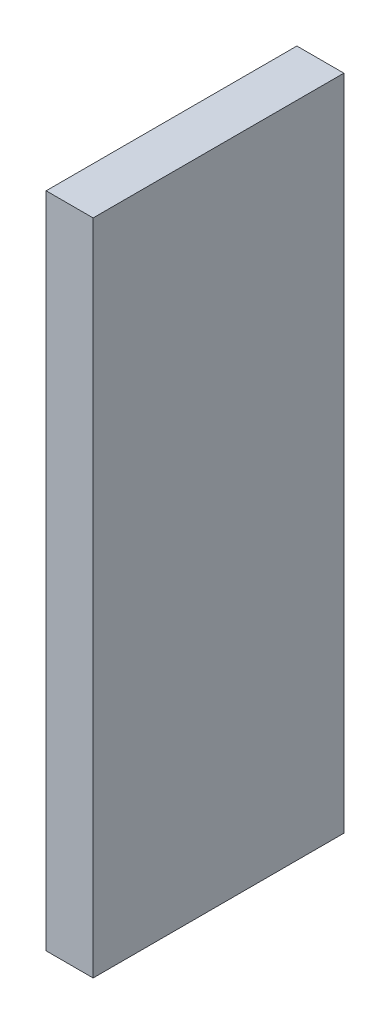
ISO-10303-21;
HEADER;
FILE_DESCRIPTION(('STEP AP214'),'2;1');
FILE_NAME('part.step','',(''),(''),'','','');
FILE_SCHEMA(('AUTOMOTIVE_DESIGN { 1 0 10303 214 1 1 1 1 }'));
ENDSEC;
DATA;
#1=APPLICATION_CONTEXT('core data for automotive mechanical design processes');
#2=APPLICATION_PROTOCOL_DEFINITION('international standard','automotive_design',2000,#1);
#3=PRODUCT_CONTEXT('',#1,'mechanical');
#4=PRODUCT('Part','Part','',(#3));
#5=PRODUCT_RELATED_PRODUCT_CATEGORY('part','',(#4));
#6=PRODUCT_DEFINITION_FORMATION('','',#4);
#7=PRODUCT_DEFINITION_CONTEXT('part definition',#1,'design');
#8=PRODUCT_DEFINITION('design','',#6,#7);
#9=PRODUCT_DEFINITION_SHAPE('','',#8);
#10=(LENGTH_UNIT() NAMED_UNIT(*) SI_UNIT(.MILLI.,.METRE.));
#11=(NAMED_UNIT(*) PLANE_ANGLE_UNIT() SI_UNIT($,.RADIAN.));
#12=(NAMED_UNIT(*) SI_UNIT($,.STERADIAN.) SOLID_ANGLE_UNIT());
#13=UNCERTAINTY_MEASURE_WITH_UNIT(LENGTH_MEASURE(1.E-05),#10,'distance_accuracy_value','');
#14=(GEOMETRIC_REPRESENTATION_CONTEXT(3) GLOBAL_UNCERTAINTY_ASSIGNED_CONTEXT((#13)) GLOBAL_UNIT_ASSIGNED_CONTEXT((#10,
#11,#12)) REPRESENTATION_CONTEXT('',''));
#15=CARTESIAN_POINT('',(0.,0.,0.));
#16=DIRECTION('',(0.,0.,1.));
#17=DIRECTION('',(1.,0.,0.));
#18=AXIS2_PLACEMENT_3D('',#15,#16,#17);
#19=CARTESIAN_POINT('',(-86.6827193201278,-335.705324425128,-870.48614798632));
#20=DIRECTION('',(-1.,0.,0.));
#21=DIRECTION('',(0.,0.,1.));
#22=AXIS2_PLACEMENT_3D('',#19,#20,#21);
#23=PLANE('',#22);
#24=DIRECTION('',(0.,1.,0.));
#25=VECTOR('',#24,1.);
#26=CARTESIAN_POINT('',(-86.6827193201278,-335.705324425128,-830.48614798632));
#27=LINE('',#26,#25);
#28=CARTESIAN_POINT('',(-86.6827193201278,-315.602297752567,-830.48614798632));
#29=VERTEX_POINT('',#28);
#30=CARTESIAN_POINT('',(-86.6827193201278,-525.602297752568,-830.48614798632));
#31=VERTEX_POINT('',#30);
#32=EDGE_CURVE('E83',#29,#31,#27,.F.);
#33=ORIENTED_EDGE('',*,*,#32,.T.);
#34=DIRECTION('',(0.,0.,1.));
#35=VECTOR('',#34,1.);
#36=CARTESIAN_POINT('',(-86.6827193201278,-525.602297752568,-870.48614798632));
#37=LINE('',#36,#35);
#38=CARTESIAN_POINT('',(-86.6827193201278,-525.602297752568,-910.486147986318));
#39=VERTEX_POINT('',#38);
#40=EDGE_CURVE('E59',#31,#39,#37,.F.);
#41=ORIENTED_EDGE('',*,*,#40,.T.);
#42=DIRECTION('',(0.,1.,0.));
#43=VECTOR('',#42,1.);
#44=CARTESIAN_POINT('',(-86.6827193201278,-335.705324425128,-910.486147986318));
#45=LINE('',#44,#43);
#46=CARTESIAN_POINT('',(-86.6827193201278,-315.602297752567,-910.486147986318));
#47=VERTEX_POINT('',#46);
#48=EDGE_CURVE('E20',#47,#39,#45,.F.);
#49=ORIENTED_EDGE('',*,*,#48,.F.);
#50=DIRECTION('',(0.,0.,-1.));
#51=VECTOR('',#50,1.);
#52=CARTESIAN_POINT('',(-86.6827193201278,-315.602297752567,-870.48614798632));
#53=LINE('',#52,#51);
#54=EDGE_CURVE('E56',#47,#29,#53,.F.);
#55=ORIENTED_EDGE('',*,*,#54,.T.);
#56=EDGE_LOOP('',(#33,#41,#49,#55));
#57=FACE_BOUND('',#56,.T.);
#58=ADVANCED_FACE('F17',(#57),#23,.F.);
#59=CARTESIAN_POINT('',(-94.1827193201277,-335.705324425128,-910.486147986318));
#60=DIRECTION('',(0.,0.,-1.));
#61=DIRECTION('',(-1.,0.,0.));
#62=AXIS2_PLACEMENT_3D('',#59,#60,#61);
#63=PLANE('',#62);
#64=ORIENTED_EDGE('',*,*,#48,.T.);
#65=DIRECTION('',(1.,0.,0.));
#66=VECTOR('',#65,1.);
#67=CARTESIAN_POINT('',(-94.1827193201328,-525.602297752568,-910.486147986318));
#68=LINE('',#67,#66);
#69=CARTESIAN_POINT('',(-101.682719320128,-525.602297752568,-910.486147986318));
#70=VERTEX_POINT('',#69);
#71=EDGE_CURVE('E86',#39,#70,#68,.F.);
#72=ORIENTED_EDGE('',*,*,#71,.T.);
#73=DIRECTION('',(0.,1.,0.));
#74=VECTOR('',#73,1.);
#75=CARTESIAN_POINT('',(-101.682719320128,-335.705324425128,-910.486147986318));
#76=LINE('',#75,#74);
#77=CARTESIAN_POINT('',(-101.682719320128,-315.602297752567,-910.486147986318));
#78=VERTEX_POINT('',#77);
#79=EDGE_CURVE('E76',#70,#78,#76,.T.);
#80=ORIENTED_EDGE('',*,*,#79,.T.);
#81=DIRECTION('',(1.,0.,0.));
#82=VECTOR('',#81,1.);
#83=CARTESIAN_POINT('',(-94.1827193201277,-315.602297752567,-910.486147986318));
#84=LINE('',#83,#82);
#85=EDGE_CURVE('E65',#78,#47,#84,.T.);
#86=ORIENTED_EDGE('',*,*,#85,.T.);
#87=EDGE_LOOP('',(#64,#72,#80,#86));
#88=FACE_BOUND('',#87,.T.);
#89=ADVANCED_FACE('F75',(#88),#63,.T.);
#90=CARTESIAN_POINT('',(-94.1827193201277,-315.602297752567,-870.48614798632));
#91=DIRECTION('',(0.,-1.,0.));
#92=DIRECTION('',(0.,0.,-1.));
#93=AXIS2_PLACEMENT_3D('',#90,#91,#92);
#94=PLANE('',#93);
#95=DIRECTION('',(-1.,0.,0.));
#96=VECTOR('',#95,1.);
#97=CARTESIAN_POINT('',(-94.1827193201277,-315.602297752567,-830.48614798632));
#98=LINE('',#97,#96);
#99=CARTESIAN_POINT('',(-101.682719320129,-315.602297752567,-830.48614798632));
#100=VERTEX_POINT('',#99);
#101=EDGE_CURVE('E71',#100,#29,#98,.F.);
#102=ORIENTED_EDGE('',*,*,#101,.T.);
#103=ORIENTED_EDGE('',*,*,#54,.F.);
#104=ORIENTED_EDGE('',*,*,#85,.F.);
#105=DIRECTION('',(0.,0.,-1.));
#106=VECTOR('',#105,1.);
#107=CARTESIAN_POINT('',(-101.682719320128,-315.602297752567,-870.48614798632));
#108=LINE('',#107,#106);
#109=EDGE_CURVE('E94',#78,#100,#108,.F.);
#110=ORIENTED_EDGE('',*,*,#109,.T.);
#111=EDGE_LOOP('',(#102,#103,#104,#110));
#112=FACE_BOUND('',#111,.T.);
#113=ADVANCED_FACE('F68',(#112),#94,.F.);
#114=CARTESIAN_POINT('',(-94.1827193201277,-335.705324425128,-830.48614798632));
#115=DIRECTION('',(0.,0.,-1.));
#116=DIRECTION('',(-1.,0.,0.));
#117=AXIS2_PLACEMENT_3D('',#114,#115,#116);
#118=PLANE('',#117);
#119=DIRECTION('',(1.,0.,0.));
#120=VECTOR('',#119,1.);
#121=CARTESIAN_POINT('',(-94.1827193201328,-525.602297752568,-830.48614798632));
#122=LINE('',#121,#120);
#123=CARTESIAN_POINT('',(-101.682719320129,-525.602297752568,-830.48614798632));
#124=VERTEX_POINT('',#123);
#125=EDGE_CURVE('E35',#124,#31,#122,.T.);
#126=ORIENTED_EDGE('',*,*,#125,.T.);
#127=ORIENTED_EDGE('',*,*,#32,.F.);
#128=ORIENTED_EDGE('',*,*,#101,.F.);
#129=DIRECTION('',(0.,1.,0.));
#130=VECTOR('',#129,1.);
#131=CARTESIAN_POINT('',(-101.682719320128,-335.705324425128,-830.48614798632));
#132=LINE('',#131,#130);
#133=EDGE_CURVE('E27',#100,#124,#132,.F.);
#134=ORIENTED_EDGE('',*,*,#133,.T.);
#135=EDGE_LOOP('',(#126,#127,#128,#134));
#136=FACE_BOUND('',#135,.T.);
#137=ADVANCED_FACE('F101',(#136),#118,.F.);
#138=CARTESIAN_POINT('',(-94.1827193201328,-525.602297752568,-870.48614798632));
#139=DIRECTION('',(0.,1.,0.));
#140=DIRECTION('',(0.,0.,1.));
#141=AXIS2_PLACEMENT_3D('',#138,#139,#140);
#142=PLANE('',#141);
#143=ORIENTED_EDGE('',*,*,#125,.F.);
#144=DIRECTION('',(0.,0.,-1.));
#145=VECTOR('',#144,1.);
#146=CARTESIAN_POINT('',(-101.682719320128,-525.602297752568,-870.48614798632));
#147=LINE('',#146,#145);
#148=EDGE_CURVE('E11',#124,#70,#147,.T.);
#149=ORIENTED_EDGE('',*,*,#148,.T.);
#150=ORIENTED_EDGE('',*,*,#71,.F.);
#151=ORIENTED_EDGE('',*,*,#40,.F.);
#152=EDGE_LOOP('',(#143,#149,#150,#151));
#153=FACE_BOUND('',#152,.T.);
#154=ADVANCED_FACE('F104',(#153),#142,.F.);
#155=CARTESIAN_POINT('',(-101.682719320128,-335.705324425128,-870.48614798632));
#156=DIRECTION('',(1.,0.,0.));
#157=DIRECTION('',(0.,0.,-1.));
#158=AXIS2_PLACEMENT_3D('',#155,#156,#157);
#159=PLANE('',#158);
#160=ORIENTED_EDGE('',*,*,#133,.F.);
#161=ORIENTED_EDGE('',*,*,#109,.F.);
#162=ORIENTED_EDGE('',*,*,#79,.F.);
#163=ORIENTED_EDGE('',*,*,#148,.F.);
#164=EDGE_LOOP('',(#160,#161,#162,#163));
#165=FACE_BOUND('',#164,.T.);
#166=ADVANCED_FACE('F103',(#165),#159,.F.);
#167=CLOSED_SHELL('',(#58,#89,#113,#137,#154,#166));
#168=MANIFOLD_SOLID_BREP('B1',#167);
#169=ADVANCED_BREP_SHAPE_REPRESENTATION('',(#18,#168),#14);
#170=SHAPE_DEFINITION_REPRESENTATION(#9,#169);
ENDSEC;
END-ISO-10303-21;
